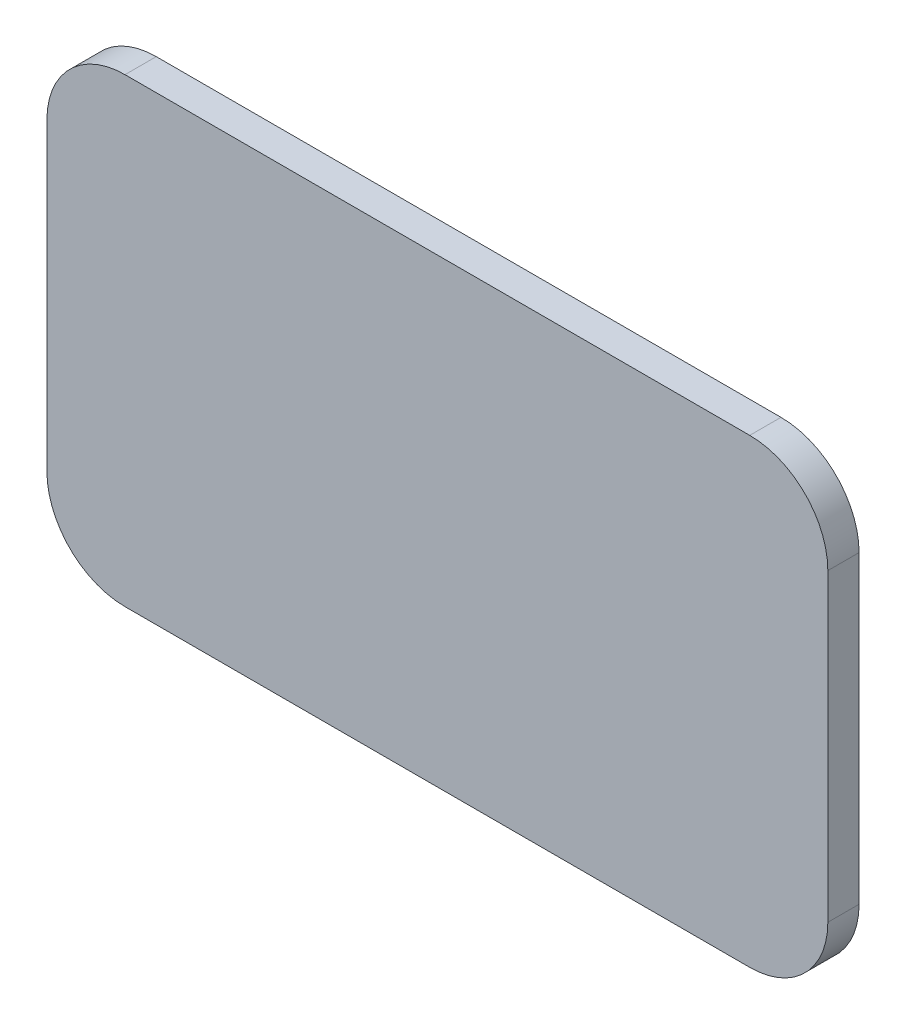
ISO-10303-21;
HEADER;
FILE_DESCRIPTION(('STEP AP214'),'2;1');
FILE_NAME('part.step','',(''),(''),'','','');
FILE_SCHEMA(('AUTOMOTIVE_DESIGN { 1 0 10303 214 1 1 1 1 }'));
ENDSEC;
DATA;
#1=APPLICATION_CONTEXT('core data for automotive mechanical design processes');
#2=APPLICATION_PROTOCOL_DEFINITION('international standard','automotive_design',2000,#1);
#3=PRODUCT_CONTEXT('',#1,'mechanical');
#4=PRODUCT('Part','Part','',(#3));
#5=PRODUCT_RELATED_PRODUCT_CATEGORY('part','',(#4));
#6=PRODUCT_DEFINITION_FORMATION('','',#4);
#7=PRODUCT_DEFINITION_CONTEXT('part definition',#1,'design');
#8=PRODUCT_DEFINITION('design','',#6,#7);
#9=PRODUCT_DEFINITION_SHAPE('','',#8);
#10=(LENGTH_UNIT() NAMED_UNIT(*) SI_UNIT(.MILLI.,.METRE.));
#11=(NAMED_UNIT(*) PLANE_ANGLE_UNIT() SI_UNIT($,.RADIAN.));
#12=(NAMED_UNIT(*) SI_UNIT($,.STERADIAN.) SOLID_ANGLE_UNIT());
#13=UNCERTAINTY_MEASURE_WITH_UNIT(LENGTH_MEASURE(1.E-05),#10,'distance_accuracy_value','');
#14=(GEOMETRIC_REPRESENTATION_CONTEXT(3) GLOBAL_UNCERTAINTY_ASSIGNED_CONTEXT((#13)) GLOBAL_UNIT_ASSIGNED_CONTEXT((#10,
#11,#12)) REPRESENTATION_CONTEXT('',''));
#15=CARTESIAN_POINT('',(0.,0.,0.));
#16=DIRECTION('',(0.,0.,1.));
#17=DIRECTION('',(1.,0.,0.));
#18=AXIS2_PLACEMENT_3D('',#15,#16,#17);
#19=CARTESIAN_POINT('',(-40.,-19.5,-2.));
#20=DIRECTION('',(0.,0.,1.));
#21=DIRECTION('',(1.,0.,0.));
#22=AXIS2_PLACEMENT_3D('',#19,#20,#21);
#23=CYLINDRICAL_SURFACE('',#22,10.);
#24=CARTESIAN_POINT('',(-40.,-19.5,2.));
#25=DIRECTION('',(0.,0.,1.));
#26=DIRECTION('',(1.,0.,0.));
#27=AXIS2_PLACEMENT_3D('',#24,#25,#26);
#28=CIRCLE('',#27,10.);
#29=CARTESIAN_POINT('',(-50.,-19.5,2.));
#30=VERTEX_POINT('',#29);
#31=CARTESIAN_POINT('',(-40.,-29.5,2.));
#32=VERTEX_POINT('',#31);
#33=EDGE_CURVE('E341',#30,#32,#28,.T.);
#34=ORIENTED_EDGE('',*,*,#33,.F.);
#35=DIRECTION('',(0.,0.,1.));
#36=VECTOR('',#35,1.);
#37=CARTESIAN_POINT('',(-50.,-19.5,-2.));
#38=LINE('',#37,#36);
#39=CARTESIAN_POINT('',(-50.,-19.5,-2.));
#40=VERTEX_POINT('',#39);
#41=EDGE_CURVE('E11',#40,#30,#38,.T.);
#42=ORIENTED_EDGE('',*,*,#41,.F.);
#43=CARTESIAN_POINT('',(-40.,-19.5,-2.));
#44=DIRECTION('',(0.,0.,1.));
#45=DIRECTION('',(1.,0.,0.));
#46=AXIS2_PLACEMENT_3D('',#43,#44,#45);
#47=CIRCLE('',#46,10.);
#48=CARTESIAN_POINT('',(-40.,-29.5,-2.));
#49=VERTEX_POINT('',#48);
#50=EDGE_CURVE('E342',#40,#49,#47,.T.);
#51=ORIENTED_EDGE('',*,*,#50,.T.);
#52=DIRECTION('',(0.,0.,1.));
#53=VECTOR('',#52,1.);
#54=CARTESIAN_POINT('',(-40.,-29.5,-2.));
#55=LINE('',#54,#53);
#56=EDGE_CURVE('E39',#49,#32,#55,.T.);
#57=ORIENTED_EDGE('',*,*,#56,.T.);
#58=EDGE_LOOP('',(#34,#42,#51,#57));
#59=FACE_BOUND('',#58,.T.);
#60=ADVANCED_FACE('F35',(#59),#23,.T.);
#61=CARTESIAN_POINT('',(-50.,19.5,-2.));
#62=DIRECTION('',(-1.,0.,0.));
#63=DIRECTION('',(0.,0.,1.));
#64=AXIS2_PLACEMENT_3D('',#61,#62,#63);
#65=PLANE('',#64);
#66=DIRECTION('',(0.,-1.,0.));
#67=VECTOR('',#66,1.);
#68=CARTESIAN_POINT('',(-50.,19.5,2.));
#69=LINE('',#68,#67);
#70=CARTESIAN_POINT('',(-50.,19.5,2.));
#71=VERTEX_POINT('',#70);
#72=EDGE_CURVE('E346',#71,#30,#69,.T.);
#73=ORIENTED_EDGE('',*,*,#72,.F.);
#74=DIRECTION('',(0.,0.,1.));
#75=VECTOR('',#74,1.);
#76=CARTESIAN_POINT('',(-50.,19.5,-2.));
#77=LINE('',#76,#75);
#78=CARTESIAN_POINT('',(-50.,19.5,-2.));
#79=VERTEX_POINT('',#78);
#80=EDGE_CURVE('E44',#79,#71,#77,.T.);
#81=ORIENTED_EDGE('',*,*,#80,.F.);
#82=DIRECTION('',(0.,-1.,0.));
#83=VECTOR('',#82,1.);
#84=CARTESIAN_POINT('',(-50.,19.5,-2.));
#85=LINE('',#84,#83);
#86=EDGE_CURVE('E364',#79,#40,#85,.T.);
#87=ORIENTED_EDGE('',*,*,#86,.T.);
#88=ORIENTED_EDGE('',*,*,#41,.T.);
#89=EDGE_LOOP('',(#73,#81,#87,#88));
#90=FACE_BOUND('',#89,.T.);
#91=ADVANCED_FACE('F411',(#90),#65,.T.);
#92=CARTESIAN_POINT('',(-40.,19.5,-2.));
#93=DIRECTION('',(0.,0.,1.));
#94=DIRECTION('',(1.,0.,0.));
#95=AXIS2_PLACEMENT_3D('',#92,#93,#94);
#96=CYLINDRICAL_SURFACE('',#95,10.);
#97=CARTESIAN_POINT('',(-40.,19.5,2.));
#98=DIRECTION('',(0.,0.,1.));
#99=DIRECTION('',(1.,0.,0.));
#100=AXIS2_PLACEMENT_3D('',#97,#98,#99);
#101=CIRCLE('',#100,10.);
#102=CARTESIAN_POINT('',(-40.,29.5,2.));
#103=VERTEX_POINT('',#102);
#104=EDGE_CURVE('E384',#103,#71,#101,.T.);
#105=ORIENTED_EDGE('',*,*,#104,.F.);
#106=DIRECTION('',(0.,0.,1.));
#107=VECTOR('',#106,1.);
#108=CARTESIAN_POINT('',(-40.,29.5,-2.));
#109=LINE('',#108,#107);
#110=CARTESIAN_POINT('',(-40.,29.5,-2.));
#111=VERTEX_POINT('',#110);
#112=EDGE_CURVE('E390',#111,#103,#109,.T.);
#113=ORIENTED_EDGE('',*,*,#112,.F.);
#114=CARTESIAN_POINT('',(-40.,19.5,-2.));
#115=DIRECTION('',(0.,0.,1.));
#116=DIRECTION('',(1.,0.,0.));
#117=AXIS2_PLACEMENT_3D('',#114,#115,#116);
#118=CIRCLE('',#117,10.);
#119=EDGE_CURVE('E361',#111,#79,#118,.T.);
#120=ORIENTED_EDGE('',*,*,#119,.T.);
#121=ORIENTED_EDGE('',*,*,#80,.T.);
#122=EDGE_LOOP('',(#105,#113,#120,#121));
#123=FACE_BOUND('',#122,.T.);
#124=ADVANCED_FACE('F430',(#123),#96,.T.);
#125=CARTESIAN_POINT('',(40.,29.5,-2.));
#126=DIRECTION('',(0.,1.,0.));
#127=DIRECTION('',(0.,0.,1.));
#128=AXIS2_PLACEMENT_3D('',#125,#126,#127);
#129=PLANE('',#128);
#130=DIRECTION('',(-1.,0.,0.));
#131=VECTOR('',#130,1.);
#132=CARTESIAN_POINT('',(40.,29.5,2.));
#133=LINE('',#132,#131);
#134=CARTESIAN_POINT('',(40.,29.5,2.));
#135=VERTEX_POINT('',#134);
#136=EDGE_CURVE('E381',#135,#103,#133,.T.);
#137=ORIENTED_EDGE('',*,*,#136,.F.);
#138=DIRECTION('',(0.,0.,1.));
#139=VECTOR('',#138,1.);
#140=CARTESIAN_POINT('',(40.,29.5,-2.));
#141=LINE('',#140,#139);
#142=CARTESIAN_POINT('',(40.,29.5,-2.));
#143=VERTEX_POINT('',#142);
#144=EDGE_CURVE('E392',#143,#135,#141,.T.);
#145=ORIENTED_EDGE('',*,*,#144,.F.);
#146=DIRECTION('',(-1.,0.,0.));
#147=VECTOR('',#146,1.);
#148=CARTESIAN_POINT('',(40.,29.5,-2.));
#149=LINE('',#148,#147);
#150=EDGE_CURVE('E358',#143,#111,#149,.T.);
#151=ORIENTED_EDGE('',*,*,#150,.T.);
#152=ORIENTED_EDGE('',*,*,#112,.T.);
#153=EDGE_LOOP('',(#137,#145,#151,#152));
#154=FACE_BOUND('',#153,.T.);
#155=ADVANCED_FACE('F428',(#154),#129,.T.);
#156=CARTESIAN_POINT('',(40.,19.5,-2.));
#157=DIRECTION('',(0.,0.,1.));
#158=DIRECTION('',(1.,0.,0.));
#159=AXIS2_PLACEMENT_3D('',#156,#157,#158);
#160=CYLINDRICAL_SURFACE('',#159,10.);
#161=CARTESIAN_POINT('',(40.,19.5,2.));
#162=DIRECTION('',(0.,0.,1.));
#163=DIRECTION('',(1.,0.,0.));
#164=AXIS2_PLACEMENT_3D('',#161,#162,#163);
#165=CIRCLE('',#164,10.);
#166=CARTESIAN_POINT('',(50.,19.5,2.));
#167=VERTEX_POINT('',#166);
#168=EDGE_CURVE('E378',#167,#135,#165,.T.);
#169=ORIENTED_EDGE('',*,*,#168,.F.);
#170=DIRECTION('',(0.,0.,1.));
#171=VECTOR('',#170,1.);
#172=CARTESIAN_POINT('',(50.,19.5,-2.));
#173=LINE('',#172,#171);
#174=CARTESIAN_POINT('',(50.,19.5,-2.));
#175=VERTEX_POINT('',#174);
#176=EDGE_CURVE('E394',#175,#167,#173,.T.);
#177=ORIENTED_EDGE('',*,*,#176,.F.);
#178=CARTESIAN_POINT('',(40.,19.5,-2.));
#179=DIRECTION('',(0.,0.,1.));
#180=DIRECTION('',(1.,0.,0.));
#181=AXIS2_PLACEMENT_3D('',#178,#179,#180);
#182=CIRCLE('',#181,10.);
#183=EDGE_CURVE('E355',#175,#143,#182,.T.);
#184=ORIENTED_EDGE('',*,*,#183,.T.);
#185=ORIENTED_EDGE('',*,*,#144,.T.);
#186=EDGE_LOOP('',(#169,#177,#184,#185));
#187=FACE_BOUND('',#186,.T.);
#188=ADVANCED_FACE('F424',(#187),#160,.T.);
#189=CARTESIAN_POINT('',(50.,-19.5,-2.));
#190=DIRECTION('',(1.,0.,0.));
#191=DIRECTION('',(0.,0.,-1.));
#192=AXIS2_PLACEMENT_3D('',#189,#190,#191);
#193=PLANE('',#192);
#194=DIRECTION('',(0.,1.,0.));
#195=VECTOR('',#194,1.);
#196=CARTESIAN_POINT('',(50.,-19.5,2.));
#197=LINE('',#196,#195);
#198=CARTESIAN_POINT('',(50.,-19.5,2.));
#199=VERTEX_POINT('',#198);
#200=EDGE_CURVE('E375',#199,#167,#197,.T.);
#201=ORIENTED_EDGE('',*,*,#200,.F.);
#202=DIRECTION('',(0.,0.,1.));
#203=VECTOR('',#202,1.);
#204=CARTESIAN_POINT('',(50.,-19.5,-2.));
#205=LINE('',#204,#203);
#206=CARTESIAN_POINT('',(50.,-19.5,-2.));
#207=VERTEX_POINT('',#206);
#208=EDGE_CURVE('E396',#207,#199,#205,.T.);
#209=ORIENTED_EDGE('',*,*,#208,.F.);
#210=DIRECTION('',(0.,1.,0.));
#211=VECTOR('',#210,1.);
#212=CARTESIAN_POINT('',(50.,-19.5,-2.));
#213=LINE('',#212,#211);
#214=EDGE_CURVE('E352',#207,#175,#213,.T.);
#215=ORIENTED_EDGE('',*,*,#214,.T.);
#216=ORIENTED_EDGE('',*,*,#176,.T.);
#217=EDGE_LOOP('',(#201,#209,#215,#216));
#218=FACE_BOUND('',#217,.T.);
#219=ADVANCED_FACE('F422',(#218),#193,.T.);
#220=CARTESIAN_POINT('',(40.,-19.5,-2.));
#221=DIRECTION('',(0.,0.,1.));
#222=DIRECTION('',(1.,0.,0.));
#223=AXIS2_PLACEMENT_3D('',#220,#221,#222);
#224=CYLINDRICAL_SURFACE('',#223,10.);
#225=CARTESIAN_POINT('',(40.,-19.5,2.));
#226=DIRECTION('',(0.,0.,1.));
#227=DIRECTION('',(1.,0.,0.));
#228=AXIS2_PLACEMENT_3D('',#225,#226,#227);
#229=CIRCLE('',#228,10.);
#230=CARTESIAN_POINT('',(40.,-29.5,2.));
#231=VERTEX_POINT('',#230);
#232=EDGE_CURVE('E372',#231,#199,#229,.T.);
#233=ORIENTED_EDGE('',*,*,#232,.F.);
#234=DIRECTION('',(0.,0.,1.));
#235=VECTOR('',#234,1.);
#236=CARTESIAN_POINT('',(40.,-29.5,-2.));
#237=LINE('',#236,#235);
#238=CARTESIAN_POINT('',(40.,-29.5,-2.));
#239=VERTEX_POINT('',#238);
#240=EDGE_CURVE('E397',#239,#231,#237,.T.);
#241=ORIENTED_EDGE('',*,*,#240,.F.);
#242=CARTESIAN_POINT('',(40.,-19.5,-2.));
#243=DIRECTION('',(0.,0.,1.));
#244=DIRECTION('',(1.,0.,0.));
#245=AXIS2_PLACEMENT_3D('',#242,#243,#244);
#246=CIRCLE('',#245,10.);
#247=EDGE_CURVE('E349',#239,#207,#246,.T.);
#248=ORIENTED_EDGE('',*,*,#247,.T.);
#249=ORIENTED_EDGE('',*,*,#208,.T.);
#250=EDGE_LOOP('',(#233,#241,#248,#249));
#251=FACE_BOUND('',#250,.T.);
#252=ADVANCED_FACE('F418',(#251),#224,.T.);
#253=CARTESIAN_POINT('',(-40.,-29.5,-2.));
#254=DIRECTION('',(0.,-1.,0.));
#255=DIRECTION('',(0.,0.,-1.));
#256=AXIS2_PLACEMENT_3D('',#253,#254,#255);
#257=PLANE('',#256);
#258=DIRECTION('',(1.,0.,0.));
#259=VECTOR('',#258,1.);
#260=CARTESIAN_POINT('',(-40.,-29.5,2.));
#261=LINE('',#260,#259);
#262=EDGE_CURVE('E369',#32,#231,#261,.T.);
#263=ORIENTED_EDGE('',*,*,#262,.F.);
#264=ORIENTED_EDGE('',*,*,#56,.F.);
#265=DIRECTION('',(1.,0.,0.));
#266=VECTOR('',#265,1.);
#267=CARTESIAN_POINT('',(-40.,-29.5,-2.));
#268=LINE('',#267,#266);
#269=EDGE_CURVE('E345',#49,#239,#268,.T.);
#270=ORIENTED_EDGE('',*,*,#269,.T.);
#271=ORIENTED_EDGE('',*,*,#240,.T.);
#272=EDGE_LOOP('',(#263,#264,#270,#271));
#273=FACE_BOUND('',#272,.T.);
#274=ADVANCED_FACE('F405',(#273),#257,.T.);
#275=CARTESIAN_POINT('',(-40.,-19.5,-2.));
#276=DIRECTION('',(0.,0.,1.));
#277=DIRECTION('',(1.,0.,0.));
#278=AXIS2_PLACEMENT_3D('',#275,#276,#277);
#279=PLANE('',#278);
#280=CARTESIAN_POINT('',(-40.,19.5,-2.));
#281=DIRECTION('',(0.,0.,-1.));
#282=DIRECTION('',(-1.,0.,0.));
#283=AXIS2_PLACEMENT_3D('',#280,#281,#282);
#284=CIRCLE('',#283,6.1);
#285=CARTESIAN_POINT('',(-46.1,19.5,-2.));
#286=VERTEX_POINT('',#285);
#287=CARTESIAN_POINT('',(-40.,25.6,-2.));
#288=VERTEX_POINT('',#287);
#289=EDGE_CURVE('E234',#286,#288,#284,.T.);
#290=ORIENTED_EDGE('',*,*,#289,.F.);
#291=DIRECTION('',(0.,1.,0.));
#292=VECTOR('',#291,1.);
#293=CARTESIAN_POINT('',(-46.1,-19.5,-2.));
#294=LINE('',#293,#292);
#295=CARTESIAN_POINT('',(-46.1,-19.5,-2.));
#296=VERTEX_POINT('',#295);
#297=EDGE_CURVE('E216',#296,#286,#294,.T.);
#298=ORIENTED_EDGE('',*,*,#297,.F.);
#299=CARTESIAN_POINT('',(-40.,-19.5,-2.));
#300=DIRECTION('',(0.,0.,-1.));
#301=DIRECTION('',(-1.,0.,0.));
#302=AXIS2_PLACEMENT_3D('',#299,#300,#301);
#303=CIRCLE('',#302,6.1);
#304=CARTESIAN_POINT('',(-40.,-25.6,-2.));
#305=VERTEX_POINT('',#304);
#306=EDGE_CURVE('E225',#305,#296,#303,.T.);
#307=ORIENTED_EDGE('',*,*,#306,.F.);
#308=DIRECTION('',(-1.,0.,0.));
#309=VECTOR('',#308,1.);
#310=CARTESIAN_POINT('',(40.,-25.6,-2.));
#311=LINE('',#310,#309);
#312=CARTESIAN_POINT('',(40.,-25.6,-2.));
#313=VERTEX_POINT('',#312);
#314=EDGE_CURVE('E52',#313,#305,#311,.T.);
#315=ORIENTED_EDGE('',*,*,#314,.F.);
#316=CARTESIAN_POINT('',(40.,-19.5,-2.));
#317=DIRECTION('',(0.,0.,-1.));
#318=DIRECTION('',(-1.,0.,0.));
#319=AXIS2_PLACEMENT_3D('',#316,#317,#318);
#320=CIRCLE('',#319,6.1);
#321=CARTESIAN_POINT('',(46.1,-19.5,-2.));
#322=VERTEX_POINT('',#321);
#323=EDGE_CURVE('E248',#322,#313,#320,.T.);
#324=ORIENTED_EDGE('',*,*,#323,.F.);
#325=DIRECTION('',(0.,-1.,0.));
#326=VECTOR('',#325,1.);
#327=CARTESIAN_POINT('',(46.1,19.5,-2.));
#328=LINE('',#327,#326);
#329=CARTESIAN_POINT('',(46.1,19.5,-2.));
#330=VERTEX_POINT('',#329);
#331=EDGE_CURVE('E245',#330,#322,#328,.T.);
#332=ORIENTED_EDGE('',*,*,#331,.F.);
#333=CARTESIAN_POINT('',(40.,19.5,-2.));
#334=DIRECTION('',(0.,0.,-1.));
#335=DIRECTION('',(-1.,0.,0.));
#336=AXIS2_PLACEMENT_3D('',#333,#334,#335);
#337=CIRCLE('',#336,6.10000000000001);
#338=CARTESIAN_POINT('',(40.,25.6,-2.));
#339=VERTEX_POINT('',#338);
#340=EDGE_CURVE('E242',#339,#330,#337,.T.);
#341=ORIENTED_EDGE('',*,*,#340,.F.);
#342=DIRECTION('',(1.,0.,0.));
#343=VECTOR('',#342,1.);
#344=CARTESIAN_POINT('',(-40.,25.6,-2.));
#345=LINE('',#344,#343);
#346=EDGE_CURVE('E236',#288,#339,#345,.T.);
#347=ORIENTED_EDGE('',*,*,#346,.F.);
#348=EDGE_LOOP('',(#290,#298,#307,#315,#324,#332,#341,#347));
#349=FACE_BOUND('',#348,.T.);
#350=ORIENTED_EDGE('',*,*,#50,.F.);
#351=ORIENTED_EDGE('',*,*,#86,.F.);
#352=ORIENTED_EDGE('',*,*,#119,.F.);
#353=ORIENTED_EDGE('',*,*,#150,.F.);
#354=ORIENTED_EDGE('',*,*,#183,.F.);
#355=ORIENTED_EDGE('',*,*,#214,.F.);
#356=ORIENTED_EDGE('',*,*,#247,.F.);
#357=ORIENTED_EDGE('',*,*,#269,.F.);
#358=EDGE_LOOP('',(#350,#351,#352,#353,#354,#355,#356,#357));
#359=FACE_BOUND('',#358,.T.);
#360=ADVANCED_FACE('F230',(#349,#359),#279,.F.);
#361=CARTESIAN_POINT('',(0.,0.,2.));
#362=DIRECTION('',(0.,0.,-1.));
#363=DIRECTION('',(-1.,0.,0.));
#364=AXIS2_PLACEMENT_3D('',#361,#362,#363);
#365=PLANE('',#364);
#366=ORIENTED_EDGE('',*,*,#33,.T.);
#367=ORIENTED_EDGE('',*,*,#262,.T.);
#368=ORIENTED_EDGE('',*,*,#232,.T.);
#369=ORIENTED_EDGE('',*,*,#200,.T.);
#370=ORIENTED_EDGE('',*,*,#168,.T.);
#371=ORIENTED_EDGE('',*,*,#136,.T.);
#372=ORIENTED_EDGE('',*,*,#104,.T.);
#373=ORIENTED_EDGE('',*,*,#72,.T.);
#374=EDGE_LOOP('',(#366,#367,#368,#369,#370,#371,#372,#373));
#375=FACE_BOUND('',#374,.T.);
#376=ADVANCED_FACE('F407',(#375),#365,.F.);
#377=CARTESIAN_POINT('',(-46.1,-19.5,105.462220723821));
#378=DIRECTION('',(-1.,0.,0.));
#379=DIRECTION('',(0.,0.,1.));
#380=AXIS2_PLACEMENT_3D('',#377,#378,#379);
#381=PLANE('',#380);
#382=DIRECTION('',(0.,-1.,0.));
#383=VECTOR('',#382,1.);
#384=CARTESIAN_POINT('',(-46.1,-19.5,0.));
#385=LINE('',#384,#383);
#386=CARTESIAN_POINT('',(-46.1,19.5,0.));
#387=VERTEX_POINT('',#386);
#388=CARTESIAN_POINT('',(-46.1,-19.5,0.));
#389=VERTEX_POINT('',#388);
#390=EDGE_CURVE('E219',#387,#389,#385,.T.);
#391=ORIENTED_EDGE('',*,*,#390,.T.);
#392=DIRECTION('',(0.,0.,-1.));
#393=VECTOR('',#392,1.);
#394=CARTESIAN_POINT('',(-46.1,-19.5,105.462220723821));
#395=LINE('',#394,#393);
#396=EDGE_CURVE('E211',#389,#296,#395,.T.);
#397=ORIENTED_EDGE('',*,*,#396,.T.);
#398=ORIENTED_EDGE('',*,*,#297,.T.);
#399=DIRECTION('',(0.,0.,-1.));
#400=VECTOR('',#399,1.);
#401=CARTESIAN_POINT('',(-46.1,19.5,105.462220723821));
#402=LINE('',#401,#400);
#403=EDGE_CURVE('E222',#387,#286,#402,.T.);
#404=ORIENTED_EDGE('',*,*,#403,.F.);
#405=EDGE_LOOP('',(#391,#397,#398,#404));
#406=FACE_BOUND('',#405,.T.);
#407=ADVANCED_FACE('F213',(#406),#381,.F.);
#408=CARTESIAN_POINT('',(-40.,19.5,105.462220723821));
#409=DIRECTION('',(0.,0.,-1.));
#410=DIRECTION('',(-1.,0.,0.));
#411=AXIS2_PLACEMENT_3D('',#408,#409,#410);
#412=CYLINDRICAL_SURFACE('',#411,6.1);
#413=CARTESIAN_POINT('',(-40.,19.5,0.));
#414=DIRECTION('',(0.,0.,-1.));
#415=DIRECTION('',(-1.,0.,0.));
#416=AXIS2_PLACEMENT_3D('',#413,#414,#415);
#417=CIRCLE('',#416,6.1);
#418=CARTESIAN_POINT('',(-40.,25.6,0.));
#419=VERTEX_POINT('',#418);
#420=EDGE_CURVE('E253',#419,#387,#417,.F.);
#421=ORIENTED_EDGE('',*,*,#420,.T.);
#422=ORIENTED_EDGE('',*,*,#403,.T.);
#423=ORIENTED_EDGE('',*,*,#289,.T.);
#424=DIRECTION('',(0.,0.,-1.));
#425=VECTOR('',#424,1.);
#426=CARTESIAN_POINT('',(-40.,25.6,105.462220723821));
#427=LINE('',#426,#425);
#428=EDGE_CURVE('E262',#419,#288,#427,.T.);
#429=ORIENTED_EDGE('',*,*,#428,.F.);
#430=EDGE_LOOP('',(#421,#422,#423,#429));
#431=FACE_BOUND('',#430,.T.);
#432=ADVANCED_FACE('F450',(#431),#412,.F.);
#433=CARTESIAN_POINT('',(-40.,25.6,105.462220723821));
#434=DIRECTION('',(0.,1.,0.));
#435=DIRECTION('',(0.,0.,1.));
#436=AXIS2_PLACEMENT_3D('',#433,#434,#435);
#437=PLANE('',#436);
#438=DIRECTION('',(-1.,0.,0.));
#439=VECTOR('',#438,1.);
#440=CARTESIAN_POINT('',(-40.,25.6,0.));
#441=LINE('',#440,#439);
#442=CARTESIAN_POINT('',(40.,25.6,0.));
#443=VERTEX_POINT('',#442);
#444=EDGE_CURVE('E552',#443,#419,#441,.T.);
#445=ORIENTED_EDGE('',*,*,#444,.T.);
#446=ORIENTED_EDGE('',*,*,#428,.T.);
#447=ORIENTED_EDGE('',*,*,#346,.T.);
#448=DIRECTION('',(0.,0.,-1.));
#449=VECTOR('',#448,1.);
#450=CARTESIAN_POINT('',(40.,25.6,105.462220723821));
#451=LINE('',#450,#449);
#452=EDGE_CURVE('E260',#443,#339,#451,.T.);
#453=ORIENTED_EDGE('',*,*,#452,.F.);
#454=EDGE_LOOP('',(#445,#446,#447,#453));
#455=FACE_BOUND('',#454,.T.);
#456=ADVANCED_FACE('F511',(#455),#437,.F.);
#457=CARTESIAN_POINT('',(40.,19.5,105.462220723821));
#458=DIRECTION('',(0.,0.,-1.));
#459=DIRECTION('',(-1.,0.,0.));
#460=AXIS2_PLACEMENT_3D('',#457,#458,#459);
#461=CYLINDRICAL_SURFACE('',#460,6.10000000000001);
#462=CARTESIAN_POINT('',(40.,19.5,0.));
#463=DIRECTION('',(0.,0.,-1.));
#464=DIRECTION('',(-1.,0.,0.));
#465=AXIS2_PLACEMENT_3D('',#462,#463,#464);
#466=CIRCLE('',#465,6.10000000000001);
#467=CARTESIAN_POINT('',(46.1,19.5,0.));
#468=VERTEX_POINT('',#467);
#469=EDGE_CURVE('E549',#468,#443,#466,.F.);
#470=ORIENTED_EDGE('',*,*,#469,.T.);
#471=ORIENTED_EDGE('',*,*,#452,.T.);
#472=ORIENTED_EDGE('',*,*,#340,.T.);
#473=DIRECTION('',(0.,0.,-1.));
#474=VECTOR('',#473,1.);
#475=CARTESIAN_POINT('',(46.1,19.5,105.462220723821));
#476=LINE('',#475,#474);
#477=EDGE_CURVE('E258',#468,#330,#476,.T.);
#478=ORIENTED_EDGE('',*,*,#477,.F.);
#479=EDGE_LOOP('',(#470,#471,#472,#478));
#480=FACE_BOUND('',#479,.T.);
#481=ADVANCED_FACE('F515',(#480),#461,.F.);
#482=CARTESIAN_POINT('',(46.1,19.5,105.462220723821));
#483=DIRECTION('',(1.,0.,0.));
#484=DIRECTION('',(0.,0.,-1.));
#485=AXIS2_PLACEMENT_3D('',#482,#483,#484);
#486=PLANE('',#485);
#487=DIRECTION('',(0.,1.,0.));
#488=VECTOR('',#487,1.);
#489=CARTESIAN_POINT('',(46.1,19.5,0.));
#490=LINE('',#489,#488);
#491=CARTESIAN_POINT('',(46.1,-19.5,0.));
#492=VERTEX_POINT('',#491);
#493=EDGE_CURVE('E541',#492,#468,#490,.T.);
#494=ORIENTED_EDGE('',*,*,#493,.T.);
#495=ORIENTED_EDGE('',*,*,#477,.T.);
#496=ORIENTED_EDGE('',*,*,#331,.T.);
#497=DIRECTION('',(0.,0.,-1.));
#498=VECTOR('',#497,1.);
#499=CARTESIAN_POINT('',(46.1,-19.5,105.462220723821));
#500=LINE('',#499,#498);
#501=EDGE_CURVE('E256',#492,#322,#500,.T.);
#502=ORIENTED_EDGE('',*,*,#501,.F.);
#503=EDGE_LOOP('',(#494,#495,#496,#502));
#504=FACE_BOUND('',#503,.T.);
#505=ADVANCED_FACE('F519',(#504),#486,.F.);
#506=CARTESIAN_POINT('',(40.,-19.5,105.462220723821));
#507=DIRECTION('',(0.,0.,-1.));
#508=DIRECTION('',(-1.,0.,0.));
#509=AXIS2_PLACEMENT_3D('',#506,#507,#508);
#510=CYLINDRICAL_SURFACE('',#509,6.1);
#511=CARTESIAN_POINT('',(40.,-19.5,0.));
#512=DIRECTION('',(0.,0.,-1.));
#513=DIRECTION('',(-1.,0.,0.));
#514=AXIS2_PLACEMENT_3D('',#511,#512,#513);
#515=CIRCLE('',#514,6.1);
#516=CARTESIAN_POINT('',(40.,-25.6,0.));
#517=VERTEX_POINT('',#516);
#518=EDGE_CURVE('E537',#517,#492,#515,.F.);
#519=ORIENTED_EDGE('',*,*,#518,.T.);
#520=ORIENTED_EDGE('',*,*,#501,.T.);
#521=ORIENTED_EDGE('',*,*,#323,.T.);
#522=DIRECTION('',(0.,0.,-1.));
#523=VECTOR('',#522,1.);
#524=CARTESIAN_POINT('',(40.,-25.6,105.462220723821));
#525=LINE('',#524,#523);
#526=EDGE_CURVE('E254',#517,#313,#525,.T.);
#527=ORIENTED_EDGE('',*,*,#526,.F.);
#528=EDGE_LOOP('',(#519,#520,#521,#527));
#529=FACE_BOUND('',#528,.T.);
#530=ADVANCED_FACE('F523',(#529),#510,.F.);
#531=CARTESIAN_POINT('',(40.,-25.6,105.462220723821));
#532=DIRECTION('',(0.,-1.,0.));
#533=DIRECTION('',(0.,0.,-1.));
#534=AXIS2_PLACEMENT_3D('',#531,#532,#533);
#535=PLANE('',#534);
#536=DIRECTION('',(1.,0.,0.));
#537=VECTOR('',#536,1.);
#538=CARTESIAN_POINT('',(40.,-25.6,0.));
#539=LINE('',#538,#537);
#540=CARTESIAN_POINT('',(-40.,-25.6,0.));
#541=VERTEX_POINT('',#540);
#542=EDGE_CURVE('E532',#541,#517,#539,.T.);
#543=ORIENTED_EDGE('',*,*,#542,.T.);
#544=ORIENTED_EDGE('',*,*,#526,.T.);
#545=ORIENTED_EDGE('',*,*,#314,.T.);
#546=DIRECTION('',(0.,0.,-1.));
#547=VECTOR('',#546,1.);
#548=CARTESIAN_POINT('',(-40.,-25.6,105.462220723821));
#549=LINE('',#548,#547);
#550=EDGE_CURVE('E227',#541,#305,#549,.T.);
#551=ORIENTED_EDGE('',*,*,#550,.F.);
#552=EDGE_LOOP('',(#543,#544,#545,#551));
#553=FACE_BOUND('',#552,.T.);
#554=ADVANCED_FACE('F507',(#553),#535,.F.);
#555=CARTESIAN_POINT('',(-40.,-19.5,105.462220723821));
#556=DIRECTION('',(0.,0.,-1.));
#557=DIRECTION('',(-1.,0.,0.));
#558=AXIS2_PLACEMENT_3D('',#555,#556,#557);
#559=CYLINDRICAL_SURFACE('',#558,6.1);
#560=CARTESIAN_POINT('',(-40.,-19.5,0.));
#561=DIRECTION('',(0.,0.,-1.));
#562=DIRECTION('',(-1.,0.,0.));
#563=AXIS2_PLACEMENT_3D('',#560,#561,#562);
#564=CIRCLE('',#563,6.1);
#565=EDGE_CURVE('E536',#389,#541,#564,.F.);
#566=ORIENTED_EDGE('',*,*,#565,.T.);
#567=ORIENTED_EDGE('',*,*,#550,.T.);
#568=ORIENTED_EDGE('',*,*,#306,.T.);
#569=ORIENTED_EDGE('',*,*,#396,.F.);
#570=EDGE_LOOP('',(#566,#567,#568,#569));
#571=FACE_BOUND('',#570,.T.);
#572=ADVANCED_FACE('F226',(#571),#559,.F.);
#573=CARTESIAN_POINT('',(0.,10.,-9.99999999999999));
#574=DIRECTION('',(0.,0.,1.));
#575=DIRECTION('',(1.,0.,0.));
#576=AXIS2_PLACEMENT_3D('',#573,#574,#575);
#577=PLANE('',#576);
#578=DIRECTION('',(-1.,0.,0.));
#579=VECTOR('',#578,1.);
#580=CARTESIAN_POINT('',(0.,-10.,-9.99999999999999));
#581=LINE('',#580,#579);
#582=CARTESIAN_POINT('',(39.8,-10.,-9.99999999999999));
#583=VERTEX_POINT('',#582);
#584=CARTESIAN_POINT('',(38.,-10.,-9.99999999999999));
#585=VERTEX_POINT('',#584);
#586=EDGE_CURVE('E320',#583,#585,#581,.T.);
#587=ORIENTED_EDGE('',*,*,#586,.T.);
#588=DIRECTION('',(0.,-1.,0.));
#589=VECTOR('',#588,1.);
#590=CARTESIAN_POINT('',(38.,10.,-9.99999999999999));
#591=LINE('',#590,#589);
#592=CARTESIAN_POINT('',(38.,10.,-9.99999999999999));
#593=VERTEX_POINT('',#592);
#594=EDGE_CURVE('E333',#593,#585,#591,.T.);
#595=ORIENTED_EDGE('',*,*,#594,.F.);
#596=DIRECTION('',(-1.,0.,0.));
#597=VECTOR('',#596,1.);
#598=CARTESIAN_POINT('',(0.,10.,-9.99999999999999));
#599=LINE('',#598,#597);
#600=CARTESIAN_POINT('',(39.8,10.,-9.99999999999999));
#601=VERTEX_POINT('',#600);
#602=EDGE_CURVE('E307',#601,#593,#599,.T.);
#603=ORIENTED_EDGE('',*,*,#602,.F.);
#604=DIRECTION('',(0.,-1.,0.));
#605=VECTOR('',#604,1.);
#606=CARTESIAN_POINT('',(39.8,10.,-9.99999999999999));
#607=LINE('',#606,#605);
#608=EDGE_CURVE('E335',#601,#583,#607,.T.);
#609=ORIENTED_EDGE('',*,*,#608,.T.);
#610=EDGE_LOOP('',(#587,#595,#603,#609));
#611=FACE_BOUND('',#610,.T.);
#612=ADVANCED_FACE('F469',(#611),#577,.F.);
#613=CARTESIAN_POINT('',(39.8,10.,-8.49999999999999));
#614=DIRECTION('',(0.,-1.,0.));
#615=DIRECTION('',(0.,0.,-1.));
#616=AXIS2_PLACEMENT_3D('',#613,#614,#615);
#617=CYLINDRICAL_SURFACE('',#616,1.5);
#618=CARTESIAN_POINT('',(39.8,-10.,-8.49999999999999));
#619=DIRECTION('',(0.,1.,0.));
#620=DIRECTION('',(0.,0.,1.));
#621=AXIS2_PLACEMENT_3D('',#618,#619,#620);
#622=CIRCLE('',#621,1.5);
#623=CARTESIAN_POINT('',(41.,-10.,-7.59999999999998));
#624=VERTEX_POINT('',#623);
#625=EDGE_CURVE('E318',#624,#583,#622,.T.);
#626=ORIENTED_EDGE('',*,*,#625,.T.);
#627=ORIENTED_EDGE('',*,*,#608,.F.);
#628=CARTESIAN_POINT('',(39.8,10.,-8.49999999999999));
#629=DIRECTION('',(0.,1.,0.));
#630=DIRECTION('',(0.,0.,1.));
#631=AXIS2_PLACEMENT_3D('',#628,#629,#630);
#632=CIRCLE('',#631,1.5);
#633=CARTESIAN_POINT('',(41.,10.,-7.59999999999998));
#634=VERTEX_POINT('',#633);
#635=EDGE_CURVE('E304',#634,#601,#632,.T.);
#636=ORIENTED_EDGE('',*,*,#635,.F.);
#637=DIRECTION('',(0.,-1.,0.));
#638=VECTOR('',#637,1.);
#639=CARTESIAN_POINT('',(41.,10.,-7.59999999999998));
#640=LINE('',#639,#638);
#641=EDGE_CURVE('E338',#634,#624,#640,.T.);
#642=ORIENTED_EDGE('',*,*,#641,.T.);
#643=EDGE_LOOP('',(#626,#627,#636,#642));
#644=FACE_BOUND('',#643,.T.);
#645=ADVANCED_FACE('F465',(#644),#617,.T.);
#646=CARTESIAN_POINT('',(-39.8,10.,-8.49999999999999));
#647=DIRECTION('',(0.,-1.,0.));
#648=DIRECTION('',(0.,0.,-1.));
#649=AXIS2_PLACEMENT_3D('',#646,#647,#648);
#650=CYLINDRICAL_SURFACE('',#649,1.5);
#651=CARTESIAN_POINT('',(-39.8,-10.,-8.49999999999999));
#652=DIRECTION('',(0.,1.,0.));
#653=DIRECTION('',(0.,0.,1.));
#654=AXIS2_PLACEMENT_3D('',#651,#652,#653);
#655=CIRCLE('',#654,1.5);
#656=CARTESIAN_POINT('',(-39.8,-10.,-9.99999999999999));
#657=VERTEX_POINT('',#656);
#658=CARTESIAN_POINT('',(-41.,-10.,-7.59999999999998));
#659=VERTEX_POINT('',#658);
#660=EDGE_CURVE('E280',#657,#659,#655,.T.);
#661=ORIENTED_EDGE('',*,*,#660,.T.);
#662=DIRECTION('',(0.,-1.,0.));
#663=VECTOR('',#662,1.);
#664=CARTESIAN_POINT('',(-41.,10.,-7.59999999999998));
#665=LINE('',#664,#663);
#666=CARTESIAN_POINT('',(-41.,10.,-7.59999999999998));
#667=VERTEX_POINT('',#666);
#668=EDGE_CURVE('E296',#667,#659,#665,.T.);
#669=ORIENTED_EDGE('',*,*,#668,.F.);
#670=CARTESIAN_POINT('',(-39.8,10.,-8.49999999999999));
#671=DIRECTION('',(0.,1.,0.));
#672=DIRECTION('',(0.,0.,1.));
#673=AXIS2_PLACEMENT_3D('',#670,#671,#672);
#674=CIRCLE('',#673,1.5);
#675=CARTESIAN_POINT('',(-39.8,10.,-9.99999999999999));
#676=VERTEX_POINT('',#675);
#677=EDGE_CURVE('E268',#676,#667,#674,.T.);
#678=ORIENTED_EDGE('',*,*,#677,.F.);
#679=DIRECTION('',(0.,-1.,0.));
#680=VECTOR('',#679,1.);
#681=CARTESIAN_POINT('',(-39.8,10.,-9.99999999999999));
#682=LINE('',#681,#680);
#683=EDGE_CURVE('E298',#676,#657,#682,.T.);
#684=ORIENTED_EDGE('',*,*,#683,.T.);
#685=EDGE_LOOP('',(#661,#669,#678,#684));
#686=FACE_BOUND('',#685,.T.);
#687=ADVANCED_FACE('F468',(#686),#650,.T.);
#688=CARTESIAN_POINT('',(0.,10.,-9.99999999999999));
#689=DIRECTION('',(0.,0.,-1.));
#690=DIRECTION('',(-1.,0.,0.));
#691=AXIS2_PLACEMENT_3D('',#688,#689,#690);
#692=PLANE('',#691);
#693=DIRECTION('',(1.,0.,0.));
#694=VECTOR('',#693,1.);
#695=CARTESIAN_POINT('',(0.,-10.,-9.99999999999999));
#696=LINE('',#695,#694);
#697=CARTESIAN_POINT('',(-38.,-10.,-9.99999999999999));
#698=VERTEX_POINT('',#697);
#699=EDGE_CURVE('E278',#657,#698,#696,.T.);
#700=ORIENTED_EDGE('',*,*,#699,.F.);
#701=ORIENTED_EDGE('',*,*,#683,.F.);
#702=DIRECTION('',(1.,0.,0.));
#703=VECTOR('',#702,1.);
#704=CARTESIAN_POINT('',(0.,10.,-9.99999999999999));
#705=LINE('',#704,#703);
#706=CARTESIAN_POINT('',(-38.,10.,-9.99999999999999));
#707=VERTEX_POINT('',#706);
#708=EDGE_CURVE('E265',#676,#707,#705,.T.);
#709=ORIENTED_EDGE('',*,*,#708,.T.);
#710=DIRECTION('',(0.,-1.,0.));
#711=VECTOR('',#710,1.);
#712=CARTESIAN_POINT('',(-38.,10.,-9.99999999999999));
#713=LINE('',#712,#711);
#714=EDGE_CURVE('E277',#707,#698,#713,.T.);
#715=ORIENTED_EDGE('',*,*,#714,.T.);
#716=EDGE_LOOP('',(#700,#701,#709,#715));
#717=FACE_BOUND('',#716,.T.);
#718=ADVANCED_FACE('F463',(#717),#692,.T.);
#719=CARTESIAN_POINT('',(41.,10.,0.));
#720=DIRECTION('',(-1.,0.,0.));
#721=DIRECTION('',(0.,0.,1.));
#722=AXIS2_PLACEMENT_3D('',#719,#720,#721);
#723=PLANE('',#722);
#724=DIRECTION('',(0.,0.,-1.));
#725=VECTOR('',#724,1.);
#726=CARTESIAN_POINT('',(41.,-10.,0.));
#727=LINE('',#726,#725);
#728=CARTESIAN_POINT('',(41.,-10.,0.));
#729=VERTEX_POINT('',#728);
#730=EDGE_CURVE('E300',#729,#624,#727,.T.);
#731=ORIENTED_EDGE('',*,*,#730,.T.);
#732=ORIENTED_EDGE('',*,*,#641,.F.);
#733=DIRECTION('',(0.,0.,-1.));
#734=VECTOR('',#733,1.);
#735=CARTESIAN_POINT('',(41.,10.,0.));
#736=LINE('',#735,#734);
#737=CARTESIAN_POINT('',(41.,10.,0.));
#738=VERTEX_POINT('',#737);
#739=EDGE_CURVE('E301',#738,#634,#736,.T.);
#740=ORIENTED_EDGE('',*,*,#739,.F.);
#741=DIRECTION('',(0.,-1.,0.));
#742=VECTOR('',#741,1.);
#743=CARTESIAN_POINT('',(41.,10.,0.));
#744=LINE('',#743,#742);
#745=EDGE_CURVE('E315',#738,#729,#744,.T.);
#746=ORIENTED_EDGE('',*,*,#745,.T.);
#747=EDGE_LOOP('',(#731,#732,#740,#746));
#748=FACE_BOUND('',#747,.T.);
#749=ADVANCED_FACE('F459',(#748),#723,.F.);
#750=CARTESIAN_POINT('',(0.,-10.,0.));
#751=DIRECTION('',(0.,1.,0.));
#752=DIRECTION('',(0.,0.,1.));
#753=AXIS2_PLACEMENT_3D('',#750,#751,#752);
#754=PLANE('',#753);
#755=ORIENTED_EDGE('',*,*,#730,.F.);
#756=DIRECTION('',(-1.,0.,0.));
#757=VECTOR('',#756,1.);
#758=CARTESIAN_POINT('',(0.,-10.,0.));
#759=LINE('',#758,#757);
#760=CARTESIAN_POINT('',(38.,-10.,0.));
#761=VERTEX_POINT('',#760);
#762=EDGE_CURVE('E305',#729,#761,#759,.T.);
#763=ORIENTED_EDGE('',*,*,#762,.T.);
#764=DIRECTION('',(0.,0.,-1.));
#765=VECTOR('',#764,1.);
#766=CARTESIAN_POINT('',(38.,-10.,0.));
#767=LINE('',#766,#765);
#768=EDGE_CURVE('E323',#761,#585,#767,.T.);
#769=ORIENTED_EDGE('',*,*,#768,.T.);
#770=ORIENTED_EDGE('',*,*,#586,.F.);
#771=ORIENTED_EDGE('',*,*,#625,.F.);
#772=EDGE_LOOP('',(#755,#763,#769,#770,#771));
#773=FACE_BOUND('',#772,.T.);
#774=ADVANCED_FACE('F462',(#773),#754,.F.);
#775=CARTESIAN_POINT('',(38.,10.,0.));
#776=DIRECTION('',(-1.,0.,0.));
#777=DIRECTION('',(0.,0.,1.));
#778=AXIS2_PLACEMENT_3D('',#775,#776,#777);
#779=PLANE('',#778);
#780=ORIENTED_EDGE('',*,*,#768,.F.);
#781=DIRECTION('',(0.,-1.,0.));
#782=VECTOR('',#781,1.);
#783=CARTESIAN_POINT('',(38.,10.,0.));
#784=LINE('',#783,#782);
#785=CARTESIAN_POINT('',(38.,10.,0.));
#786=VERTEX_POINT('',#785);
#787=EDGE_CURVE('E330',#786,#761,#784,.T.);
#788=ORIENTED_EDGE('',*,*,#787,.F.);
#789=DIRECTION('',(0.,0.,-1.));
#790=VECTOR('',#789,1.);
#791=CARTESIAN_POINT('',(38.,10.,0.));
#792=LINE('',#791,#790);
#793=EDGE_CURVE('E309',#786,#593,#792,.T.);
#794=ORIENTED_EDGE('',*,*,#793,.T.);
#795=ORIENTED_EDGE('',*,*,#594,.T.);
#796=EDGE_LOOP('',(#780,#788,#794,#795));
#797=FACE_BOUND('',#796,.T.);
#798=ADVANCED_FACE('F474',(#797),#779,.T.);
#799=CARTESIAN_POINT('',(0.,10.,0.));
#800=DIRECTION('',(0.,1.,0.));
#801=DIRECTION('',(0.,0.,1.));
#802=AXIS2_PLACEMENT_3D('',#799,#800,#801);
#803=PLANE('',#802);
#804=ORIENTED_EDGE('',*,*,#739,.T.);
#805=ORIENTED_EDGE('',*,*,#635,.T.);
#806=ORIENTED_EDGE('',*,*,#602,.T.);
#807=ORIENTED_EDGE('',*,*,#793,.F.);
#808=DIRECTION('',(-1.,0.,0.));
#809=VECTOR('',#808,1.);
#810=CARTESIAN_POINT('',(0.,10.,0.));
#811=LINE('',#810,#809);
#812=EDGE_CURVE('E312',#738,#786,#811,.T.);
#813=ORIENTED_EDGE('',*,*,#812,.F.);
#814=EDGE_LOOP('',(#804,#805,#806,#807,#813));
#815=FACE_BOUND('',#814,.T.);
#816=ADVANCED_FACE('F477',(#815),#803,.T.);
#817=CARTESIAN_POINT('',(-38.,10.,0.));
#818=DIRECTION('',(-1.,0.,0.));
#819=DIRECTION('',(0.,0.,1.));
#820=AXIS2_PLACEMENT_3D('',#817,#818,#819);
#821=PLANE('',#820);
#822=DIRECTION('',(0.,0.,-1.));
#823=VECTOR('',#822,1.);
#824=CARTESIAN_POINT('',(-38.,-10.,0.));
#825=LINE('',#824,#823);
#826=CARTESIAN_POINT('',(-38.,-10.,0.));
#827=VERTEX_POINT('',#826);
#828=EDGE_CURVE('E60',#827,#698,#825,.T.);
#829=ORIENTED_EDGE('',*,*,#828,.T.);
#830=ORIENTED_EDGE('',*,*,#714,.F.);
#831=DIRECTION('',(0.,0.,-1.));
#832=VECTOR('',#831,1.);
#833=CARTESIAN_POINT('',(-38.,10.,0.));
#834=LINE('',#833,#832);
#835=CARTESIAN_POINT('',(-38.,10.,-1.27199980871438E-13));
#836=VERTEX_POINT('',#835);
#837=EDGE_CURVE('E275',#836,#707,#834,.T.);
#838=ORIENTED_EDGE('',*,*,#837,.F.);
#839=DIRECTION('',(0.,-1.,0.));
#840=VECTOR('',#839,1.);
#841=CARTESIAN_POINT('',(-38.,10.,-1.27199980871438E-13));
#842=LINE('',#841,#840);
#843=EDGE_CURVE('E291',#836,#827,#842,.T.);
#844=ORIENTED_EDGE('',*,*,#843,.T.);
#845=EDGE_LOOP('',(#829,#830,#838,#844));
#846=FACE_BOUND('',#845,.T.);
#847=ADVANCED_FACE('F484',(#846),#821,.F.);
#848=CARTESIAN_POINT('',(0.,-10.,0.));
#849=DIRECTION('',(0.,1.,0.));
#850=DIRECTION('',(0.,0.,1.));
#851=AXIS2_PLACEMENT_3D('',#848,#849,#850);
#852=PLANE('',#851);
#853=ORIENTED_EDGE('',*,*,#699,.T.);
#854=ORIENTED_EDGE('',*,*,#828,.F.);
#855=DIRECTION('',(1.,0.,0.));
#856=VECTOR('',#855,1.);
#857=CARTESIAN_POINT('',(0.,-10.,0.));
#858=LINE('',#857,#856);
#859=CARTESIAN_POINT('',(-41.,-10.,-1.37242084624447E-13));
#860=VERTEX_POINT('',#859);
#861=EDGE_CURVE('E286',#860,#827,#858,.T.);
#862=ORIENTED_EDGE('',*,*,#861,.F.);
#863=DIRECTION('',(0.,0.,-1.));
#864=VECTOR('',#863,1.);
#865=CARTESIAN_POINT('',(-41.,-10.,0.));
#866=LINE('',#865,#864);
#867=EDGE_CURVE('E283',#860,#659,#866,.T.);
#868=ORIENTED_EDGE('',*,*,#867,.T.);
#869=ORIENTED_EDGE('',*,*,#660,.F.);
#870=EDGE_LOOP('',(#853,#854,#862,#868,#869));
#871=FACE_BOUND('',#870,.T.);
#872=ADVANCED_FACE('F496',(#871),#852,.F.);
#873=CARTESIAN_POINT('',(-41.,10.,0.));
#874=DIRECTION('',(-1.,0.,0.));
#875=DIRECTION('',(0.,0.,1.));
#876=AXIS2_PLACEMENT_3D('',#873,#874,#875);
#877=PLANE('',#876);
#878=ORIENTED_EDGE('',*,*,#867,.F.);
#879=DIRECTION('',(0.,-1.,0.));
#880=VECTOR('',#879,1.);
#881=CARTESIAN_POINT('',(-41.,10.,-1.37242084624447E-13));
#882=LINE('',#881,#880);
#883=CARTESIAN_POINT('',(-41.,10.,-1.37242084624447E-13));
#884=VERTEX_POINT('',#883);
#885=EDGE_CURVE('E293',#884,#860,#882,.T.);
#886=ORIENTED_EDGE('',*,*,#885,.F.);
#887=DIRECTION('',(0.,0.,-1.));
#888=VECTOR('',#887,1.);
#889=CARTESIAN_POINT('',(-41.,10.,0.));
#890=LINE('',#889,#888);
#891=EDGE_CURVE('E270',#884,#667,#890,.T.);
#892=ORIENTED_EDGE('',*,*,#891,.T.);
#893=ORIENTED_EDGE('',*,*,#668,.T.);
#894=EDGE_LOOP('',(#878,#886,#892,#893));
#895=FACE_BOUND('',#894,.T.);
#896=ADVANCED_FACE('F492',(#895),#877,.T.);
#897=CARTESIAN_POINT('',(0.,10.,0.));
#898=DIRECTION('',(0.,1.,0.));
#899=DIRECTION('',(0.,0.,1.));
#900=AXIS2_PLACEMENT_3D('',#897,#898,#899);
#901=PLANE('',#900);
#902=ORIENTED_EDGE('',*,*,#708,.F.);
#903=ORIENTED_EDGE('',*,*,#677,.T.);
#904=ORIENTED_EDGE('',*,*,#891,.F.);
#905=DIRECTION('',(1.,0.,0.));
#906=VECTOR('',#905,1.);
#907=CARTESIAN_POINT('',(0.,10.,0.));
#908=LINE('',#907,#906);
#909=EDGE_CURVE('E273',#884,#836,#908,.T.);
#910=ORIENTED_EDGE('',*,*,#909,.T.);
#911=ORIENTED_EDGE('',*,*,#837,.T.);
#912=EDGE_LOOP('',(#902,#903,#904,#910,#911));
#913=FACE_BOUND('',#912,.T.);
#914=ADVANCED_FACE('F495',(#913),#901,.T.);
#915=CARTESIAN_POINT('',(0.,0.,0.));
#916=DIRECTION('',(0.,0.,-1.));
#917=DIRECTION('',(-1.,0.,0.));
#918=AXIS2_PLACEMENT_3D('',#915,#916,#917);
#919=PLANE('',#918);
#920=ORIENTED_EDGE('',*,*,#909,.F.);
#921=ORIENTED_EDGE('',*,*,#885,.T.);
#922=ORIENTED_EDGE('',*,*,#861,.T.);
#923=ORIENTED_EDGE('',*,*,#843,.F.);
#924=EDGE_LOOP('',(#920,#921,#922,#923));
#925=FACE_BOUND('',#924,.T.);
#926=ORIENTED_EDGE('',*,*,#812,.T.);
#927=ORIENTED_EDGE('',*,*,#787,.T.);
#928=ORIENTED_EDGE('',*,*,#762,.F.);
#929=ORIENTED_EDGE('',*,*,#745,.F.);
#930=EDGE_LOOP('',(#926,#927,#928,#929));
#931=FACE_BOUND('',#930,.T.);
#932=ORIENTED_EDGE('',*,*,#565,.F.);
#933=ORIENTED_EDGE('',*,*,#390,.F.);
#934=ORIENTED_EDGE('',*,*,#420,.F.);
#935=ORIENTED_EDGE('',*,*,#444,.F.);
#936=ORIENTED_EDGE('',*,*,#469,.F.);
#937=ORIENTED_EDGE('',*,*,#493,.F.);
#938=ORIENTED_EDGE('',*,*,#518,.F.);
#939=ORIENTED_EDGE('',*,*,#542,.F.);
#940=EDGE_LOOP('',(#932,#933,#934,#935,#936,#937,#938,#939));
#941=FACE_BOUND('',#940,.T.);
#942=ADVANCED_FACE('F37',(#925,#931,#941),#919,.T.);
#943=CLOSED_SHELL('',(#60,#91,#124,#155,#188,#219,#252,#274,#360,#376,#407,#432,#456,#481,#505,
#530,#554,#572,#612,#645,#687,#718,#749,#774,#798,#816,#847,#872,#896,#914,#942));
#944=MANIFOLD_SOLID_BREP('B2',#943);
#945=ADVANCED_BREP_SHAPE_REPRESENTATION('',(#18,#944),#14);
#946=SHAPE_DEFINITION_REPRESENTATION(#9,#945);
ENDSEC;
END-ISO-10303-21;
